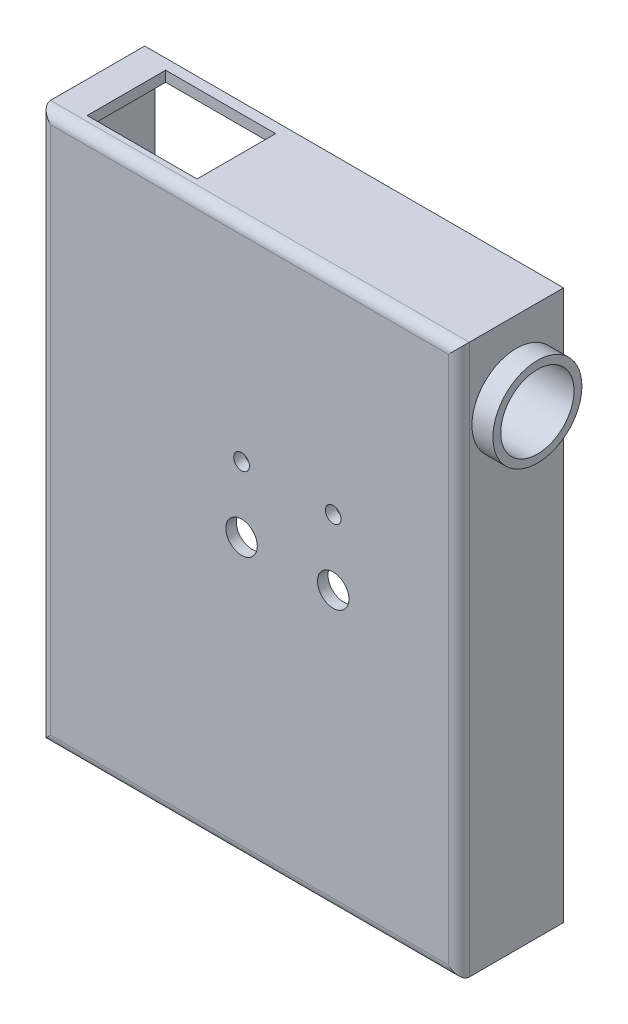
ISO-10303-21;
HEADER;
FILE_DESCRIPTION(('STEP AP214'),'2;1');
FILE_NAME('part.step','',(''),(''),'','','');
FILE_SCHEMA(('AUTOMOTIVE_DESIGN { 1 0 10303 214 1 1 1 1 }'));
ENDSEC;
DATA;
#1=APPLICATION_CONTEXT('core data for automotive mechanical design processes');
#2=APPLICATION_PROTOCOL_DEFINITION('international standard','automotive_design',2000,#1);
#3=PRODUCT_CONTEXT('',#1,'mechanical');
#4=PRODUCT('Part','Part','',(#3));
#5=PRODUCT_RELATED_PRODUCT_CATEGORY('part','',(#4));
#6=PRODUCT_DEFINITION_FORMATION('','',#4);
#7=PRODUCT_DEFINITION_CONTEXT('part definition',#1,'design');
#8=PRODUCT_DEFINITION('design','',#6,#7);
#9=PRODUCT_DEFINITION_SHAPE('','',#8);
#10=(LENGTH_UNIT() NAMED_UNIT(*) SI_UNIT(.MILLI.,.METRE.));
#11=(NAMED_UNIT(*) PLANE_ANGLE_UNIT() SI_UNIT($,.RADIAN.));
#12=(NAMED_UNIT(*) SI_UNIT($,.STERADIAN.) SOLID_ANGLE_UNIT());
#13=UNCERTAINTY_MEASURE_WITH_UNIT(LENGTH_MEASURE(1.E-05),#10,'distance_accuracy_value','');
#14=(GEOMETRIC_REPRESENTATION_CONTEXT(3) GLOBAL_UNCERTAINTY_ASSIGNED_CONTEXT((#13)) GLOBAL_UNIT_ASSIGNED_CONTEXT((#10,
#11,#12)) REPRESENTATION_CONTEXT('',''));
#15=CARTESIAN_POINT('',(0.,0.,0.));
#16=DIRECTION('',(0.,0.,1.));
#17=DIRECTION('',(1.,0.,0.));
#18=AXIS2_PLACEMENT_3D('',#15,#16,#17);
#19=CARTESIAN_POINT('',(0.,0.,18.));
#20=DIRECTION('',(0.,0.,-1.));
#21=DIRECTION('',(-1.,0.,0.));
#22=AXIS2_PLACEMENT_3D('',#19,#20,#21);
#23=PLANE('',#22);
#24=CARTESIAN_POINT('',(1039.51386895897,-1419.25124805023,18.));
#25=DIRECTION('',(0.,0.,-1.));
#26=DIRECTION('',(-1.,0.,0.));
#27=AXIS2_PLACEMENT_3D('',#24,#25,#26);
#28=CIRCLE('',#27,2.99999999999994);
#29=CARTESIAN_POINT('',(1036.51386895897,-1419.25124805023,18.));
#30=VERTEX_POINT('',#29);
#31=EDGE_CURVE('E189',#30,#30,#28,.T.);
#32=ORIENTED_EDGE('',*,*,#31,.F.);
#33=EDGE_LOOP('',(#32));
#34=FACE_BOUND('',#33,.T.);
#35=CARTESIAN_POINT('',(1087.51386895897,-1418.25124805023,18.));
#36=DIRECTION('',(0.,0.,-1.));
#37=DIRECTION('',(-1.,0.,0.));
#38=AXIS2_PLACEMENT_3D('',#35,#36,#37);
#39=CIRCLE('',#38,2.99999999999994);
#40=CARTESIAN_POINT('',(1084.51386895897,-1418.25124805023,18.));
#41=VERTEX_POINT('',#40);
#42=EDGE_CURVE('E357',#41,#41,#39,.T.);
#43=ORIENTED_EDGE('',*,*,#42,.F.);
#44=EDGE_LOOP('',(#43));
#45=FACE_BOUND('',#44,.T.);
#46=CARTESIAN_POINT('',(1087.51386895897,-1405.75124805023,18.));
#47=DIRECTION('',(0.,0.,-1.));
#48=DIRECTION('',(-1.,0.,0.));
#49=AXIS2_PLACEMENT_3D('',#46,#47,#48);
#50=CIRCLE('',#49,1.50000000000011);
#51=CARTESIAN_POINT('',(1086.01386895897,-1405.75124805023,18.));
#52=VERTEX_POINT('',#51);
#53=EDGE_CURVE('E353',#52,#52,#50,.T.);
#54=ORIENTED_EDGE('',*,*,#53,.F.);
#55=EDGE_LOOP('',(#54));
#56=FACE_BOUND('',#55,.T.);
#57=CARTESIAN_POINT('',(1070.01386895897,-1405.75124805023,18.));
#58=DIRECTION('',(0.,0.,-1.));
#59=DIRECTION('',(-1.,0.,0.));
#60=AXIS2_PLACEMENT_3D('',#57,#58,#59);
#61=CIRCLE('',#60,1.50000000000011);
#62=CARTESIAN_POINT('',(1068.51386895897,-1405.75124805023,18.));
#63=VERTEX_POINT('',#62);
#64=EDGE_CURVE('E349',#63,#63,#61,.T.);
#65=ORIENTED_EDGE('',*,*,#64,.F.);
#66=EDGE_LOOP('',(#65));
#67=FACE_BOUND('',#66,.T.);
#68=CARTESIAN_POINT('',(1070.01386895897,-1418.25124805023,18.));
#69=DIRECTION('',(0.,0.,-1.));
#70=DIRECTION('',(-1.,0.,0.));
#71=AXIS2_PLACEMENT_3D('',#68,#69,#70);
#72=CIRCLE('',#71,2.99999999999994);
#73=CARTESIAN_POINT('',(1067.01386895897,-1418.25124805023,18.));
#74=VERTEX_POINT('',#73);
#75=EDGE_CURVE('E338',#74,#74,#72,.T.);
#76=ORIENTED_EDGE('',*,*,#75,.F.);
#77=EDGE_LOOP('',(#76));
#78=FACE_BOUND('',#77,.T.);
#79=DIRECTION('',(0.,-1.,0.));
#80=VECTOR('',#79,1.);
#81=CARTESIAN_POINT('',(1109.51386895897,-1368.25124805023,18.));
#82=LINE('',#81,#80);
#83=CARTESIAN_POINT('',(1109.51386895897,-1368.25124805023,18.));
#84=VERTEX_POINT('',#83);
#85=CARTESIAN_POINT('',(1109.51386895897,-1469.25124805023,18.));
#86=VERTEX_POINT('',#85);
#87=EDGE_CURVE('E303',#84,#86,#82,.T.);
#88=ORIENTED_EDGE('',*,*,#87,.T.);
#89=DIRECTION('',(-1.,0.,0.));
#90=VECTOR('',#89,1.);
#91=CARTESIAN_POINT('',(1109.51386895897,-1469.25124805023,18.));
#92=LINE('',#91,#90);
#93=CARTESIAN_POINT('',(1033.51386895897,-1469.25124805023,18.));
#94=VERTEX_POINT('',#93);
#95=EDGE_CURVE('E307',#86,#94,#92,.T.);
#96=ORIENTED_EDGE('',*,*,#95,.T.);
#97=DIRECTION('',(0.,1.,0.));
#98=VECTOR('',#97,1.);
#99=CARTESIAN_POINT('',(1033.51386895897,-1368.25124805023,18.));
#100=LINE('',#99,#98);
#101=CARTESIAN_POINT('',(1033.51386895897,-1368.25124805023,18.));
#102=VERTEX_POINT('',#101);
#103=EDGE_CURVE('E312',#94,#102,#100,.T.);
#104=ORIENTED_EDGE('',*,*,#103,.T.);
#105=DIRECTION('',(1.,0.,0.));
#106=VECTOR('',#105,1.);
#107=CARTESIAN_POINT('',(1109.51386895897,-1368.25124805023,18.));
#108=LINE('',#107,#106);
#109=EDGE_CURVE('E316',#102,#84,#108,.T.);
#110=ORIENTED_EDGE('',*,*,#109,.T.);
#111=EDGE_LOOP('',(#88,#96,#104,#110));
#112=FACE_BOUND('',#111,.T.);
#113=DIRECTION('',(-1.,0.,0.));
#114=VECTOR('',#113,1.);
#115=CARTESIAN_POINT('',(1102.01386895897,-1389.75124805023,18.));
#116=LINE('',#115,#114);
#117=CARTESIAN_POINT('',(1102.01386895897,-1389.75124805023,18.));
#118=VERTEX_POINT('',#117);
#119=CARTESIAN_POINT('',(1072.01386895897,-1389.75124805023,18.));
#120=VERTEX_POINT('',#119);
#121=EDGE_CURVE('E263',#118,#120,#116,.T.);
#122=ORIENTED_EDGE('',*,*,#121,.F.);
#123=DIRECTION('',(0.,-1.,0.));
#124=VECTOR('',#123,1.);
#125=CARTESIAN_POINT('',(1102.01386895897,-1388.25124805023,18.));
#126=LINE('',#125,#124);
#127=CARTESIAN_POINT('',(1102.01386895897,-1388.25124805023,18.));
#128=VERTEX_POINT('',#127);
#129=EDGE_CURVE('E244',#128,#118,#126,.T.);
#130=ORIENTED_EDGE('',*,*,#129,.F.);
#131=DIRECTION('',(1.,0.,0.));
#132=VECTOR('',#131,1.);
#133=CARTESIAN_POINT('',(1102.01386895897,-1388.25124805023,18.));
#134=LINE('',#133,#132);
#135=CARTESIAN_POINT('',(1072.01386895897,-1388.25124805023,18.));
#136=VERTEX_POINT('',#135);
#137=EDGE_CURVE('E250',#136,#128,#134,.T.);
#138=ORIENTED_EDGE('',*,*,#137,.F.);
#139=DIRECTION('',(0.,1.,0.));
#140=VECTOR('',#139,1.);
#141=CARTESIAN_POINT('',(1072.01386895897,-1388.25124805023,18.));
#142=LINE('',#141,#140);
#143=EDGE_CURVE('E266',#120,#136,#142,.T.);
#144=ORIENTED_EDGE('',*,*,#143,.F.);
#145=EDGE_LOOP('',(#122,#130,#138,#144));
#146=FACE_BOUND('',#145,.T.);
#147=ADVANCED_FACE('F39',(#34,#45,#56,#67,#78,#112,#146),#23,.T.);
#148=CARTESIAN_POINT('',(1087.51386895897,-1418.25124805023,20.));
#149=DIRECTION('',(0.,0.,-1.));
#150=DIRECTION('',(-1.,0.,0.));
#151=AXIS2_PLACEMENT_3D('',#148,#149,#150);
#152=CYLINDRICAL_SURFACE('',#151,2.99999999999994);
#153=CARTESIAN_POINT('',(1087.51386895897,-1418.25124805023,20.));
#154=DIRECTION('',(0.,0.,1.));
#155=DIRECTION('',(1.,0.,0.));
#156=AXIS2_PLACEMENT_3D('',#153,#154,#155);
#157=CIRCLE('',#156,2.99999999999994);
#158=CARTESIAN_POINT('',(1090.51386895897,-1418.25124805023,20.));
#159=VERTEX_POINT('',#158);
#160=EDGE_CURVE('E366',#159,#159,#157,.T.);
#161=ORIENTED_EDGE('',*,*,#160,.T.);
#162=EDGE_LOOP('',(#161));
#163=FACE_BOUND('',#162,.T.);
#164=ORIENTED_EDGE('',*,*,#42,.T.);
#165=EDGE_LOOP('',(#164));
#166=FACE_BOUND('',#165,.T.);
#167=ADVANCED_FACE('F507',(#163,#166),#152,.F.);
#168=CARTESIAN_POINT('',(1087.51386895897,-1405.75124805023,20.));
#169=DIRECTION('',(0.,0.,-1.));
#170=DIRECTION('',(-1.,0.,0.));
#171=AXIS2_PLACEMENT_3D('',#168,#169,#170);
#172=CYLINDRICAL_SURFACE('',#171,1.50000000000011);
#173=CARTESIAN_POINT('',(1087.51386895897,-1405.75124805023,20.));
#174=DIRECTION('',(0.,0.,1.));
#175=DIRECTION('',(1.,0.,0.));
#176=AXIS2_PLACEMENT_3D('',#173,#174,#175);
#177=CIRCLE('',#176,1.50000000000011);
#178=CARTESIAN_POINT('',(1089.01386895897,-1405.75124805023,20.));
#179=VERTEX_POINT('',#178);
#180=EDGE_CURVE('E362',#179,#179,#177,.T.);
#181=ORIENTED_EDGE('',*,*,#180,.T.);
#182=EDGE_LOOP('',(#181));
#183=FACE_BOUND('',#182,.T.);
#184=ORIENTED_EDGE('',*,*,#53,.T.);
#185=EDGE_LOOP('',(#184));
#186=FACE_BOUND('',#185,.T.);
#187=ADVANCED_FACE('F510',(#183,#186),#172,.F.);
#188=CARTESIAN_POINT('',(1070.01386895897,-1405.75124805023,20.));
#189=DIRECTION('',(0.,0.,-1.));
#190=DIRECTION('',(-1.,0.,0.));
#191=AXIS2_PLACEMENT_3D('',#188,#189,#190);
#192=CYLINDRICAL_SURFACE('',#191,1.50000000000011);
#193=CARTESIAN_POINT('',(1070.01386895897,-1405.75124805023,20.));
#194=DIRECTION('',(0.,0.,1.));
#195=DIRECTION('',(1.,0.,0.));
#196=AXIS2_PLACEMENT_3D('',#193,#194,#195);
#197=CIRCLE('',#196,1.50000000000011);
#198=CARTESIAN_POINT('',(1071.51386895897,-1405.75124805023,20.));
#199=VERTEX_POINT('',#198);
#200=EDGE_CURVE('E367',#199,#199,#197,.T.);
#201=ORIENTED_EDGE('',*,*,#200,.T.);
#202=EDGE_LOOP('',(#201));
#203=FACE_BOUND('',#202,.T.);
#204=ORIENTED_EDGE('',*,*,#64,.T.);
#205=EDGE_LOOP('',(#204));
#206=FACE_BOUND('',#205,.T.);
#207=ADVANCED_FACE('F600',(#203,#206),#192,.F.);
#208=CARTESIAN_POINT('',(1070.01386895897,-1418.25124805023,20.));
#209=DIRECTION('',(0.,0.,-1.));
#210=DIRECTION('',(-1.,0.,0.));
#211=AXIS2_PLACEMENT_3D('',#208,#209,#210);
#212=CYLINDRICAL_SURFACE('',#211,2.99999999999994);
#213=CARTESIAN_POINT('',(1070.01386895897,-1418.25124805023,20.));
#214=DIRECTION('',(0.,0.,1.));
#215=DIRECTION('',(1.,0.,0.));
#216=AXIS2_PLACEMENT_3D('',#213,#214,#215);
#217=CIRCLE('',#216,2.99999999999994);
#218=CARTESIAN_POINT('',(1073.01386895897,-1418.25124805023,20.));
#219=VERTEX_POINT('',#218);
#220=EDGE_CURVE('E361',#219,#219,#217,.T.);
#221=ORIENTED_EDGE('',*,*,#220,.T.);
#222=EDGE_LOOP('',(#221));
#223=FACE_BOUND('',#222,.T.);
#224=ORIENTED_EDGE('',*,*,#75,.T.);
#225=EDGE_LOOP('',(#224));
#226=FACE_BOUND('',#225,.T.);
#227=ADVANCED_FACE('F604',(#223,#226),#212,.F.);
#228=CARTESIAN_POINT('',(1031.51386895897,-1366.25124805023,20.));
#229=DIRECTION('',(1.,0.,0.));
#230=DIRECTION('',(0.,0.,-1.));
#231=AXIS2_PLACEMENT_3D('',#228,#229,#230);
#232=PLANE('',#231);
#233=DIRECTION('',(0.,0.,-1.));
#234=VECTOR('',#233,1.);
#235=CARTESIAN_POINT('',(1031.51386895897,-1471.25124805023,20.));
#236=LINE('',#235,#234);
#237=CARTESIAN_POINT('',(1031.51386895897,-1471.25124805023,18.));
#238=VERTEX_POINT('',#237);
#239=CARTESIAN_POINT('',(1031.51386895897,-1471.25124805023,0.));
#240=VERTEX_POINT('',#239);
#241=EDGE_CURVE('E403',#238,#240,#236,.T.);
#242=ORIENTED_EDGE('',*,*,#241,.F.);
#243=DIRECTION('',(0.,-1.,0.));
#244=VECTOR('',#243,1.);
#245=CARTESIAN_POINT('',(1031.51386895897,-1366.25124805023,18.));
#246=LINE('',#245,#244);
#247=CARTESIAN_POINT('',(1031.51386895897,-1366.25124805023,18.));
#248=VERTEX_POINT('',#247);
#249=EDGE_CURVE('E449',#238,#248,#246,.F.);
#250=ORIENTED_EDGE('',*,*,#249,.T.);
#251=DIRECTION('',(0.,0.,-1.));
#252=VECTOR('',#251,1.);
#253=CARTESIAN_POINT('',(1031.51386895897,-1366.25124805023,20.));
#254=LINE('',#253,#252);
#255=CARTESIAN_POINT('',(1031.51386895897,-1366.25124805023,0.));
#256=VERTEX_POINT('',#255);
#257=EDGE_CURVE('E394',#248,#256,#254,.T.);
#258=ORIENTED_EDGE('',*,*,#257,.T.);
#259=DIRECTION('',(0.,-1.,0.));
#260=VECTOR('',#259,1.);
#261=CARTESIAN_POINT('',(1031.51386895897,-1366.25124805023,0.));
#262=LINE('',#261,#260);
#263=EDGE_CURVE('E377',#256,#240,#262,.T.);
#264=ORIENTED_EDGE('',*,*,#263,.T.);
#265=EDGE_LOOP('',(#242,#250,#258,#264));
#266=FACE_BOUND('',#265,.T.);
#267=ADVANCED_FACE('F487',(#266),#232,.F.);
#268=CARTESIAN_POINT('',(1031.51386895897,-1471.25124805023,20.));
#269=DIRECTION('',(0.,1.,0.));
#270=DIRECTION('',(0.,0.,1.));
#271=AXIS2_PLACEMENT_3D('',#268,#269,#270);
#272=PLANE('',#271);
#273=DIRECTION('',(0.,0.,-1.));
#274=VECTOR('',#273,1.);
#275=CARTESIAN_POINT('',(1111.51386895897,-1471.25124805023,20.));
#276=LINE('',#275,#274);
#277=CARTESIAN_POINT('',(1111.51386895897,-1471.25124805023,18.));
#278=VERTEX_POINT('',#277);
#279=CARTESIAN_POINT('',(1111.51386895897,-1471.25124805023,0.));
#280=VERTEX_POINT('',#279);
#281=EDGE_CURVE('E400',#278,#280,#276,.T.);
#282=ORIENTED_EDGE('',*,*,#281,.F.);
#283=DIRECTION('',(1.,0.,0.));
#284=VECTOR('',#283,1.);
#285=CARTESIAN_POINT('',(1031.51386895897,-1471.25124805023,18.));
#286=LINE('',#285,#284);
#287=EDGE_CURVE('E453',#278,#238,#286,.F.);
#288=ORIENTED_EDGE('',*,*,#287,.T.);
#289=ORIENTED_EDGE('',*,*,#241,.T.);
#290=DIRECTION('',(1.,0.,0.));
#291=VECTOR('',#290,1.);
#292=CARTESIAN_POINT('',(1031.51386895897,-1471.25124805023,0.));
#293=LINE('',#292,#291);
#294=CARTESIAN_POINT('',(1069.01386895897,-1471.25124805023,0.));
#295=VERTEX_POINT('',#294);
#296=EDGE_CURVE('E382',#240,#295,#293,.T.);
#297=ORIENTED_EDGE('',*,*,#296,.T.);
#298=CARTESIAN_POINT('',(1071.51386895897,-1471.25124805023,0.));
#299=DIRECTION('',(0.,1.,0.));
#300=DIRECTION('',(0.,0.,1.));
#301=AXIS2_PLACEMENT_3D('',#298,#299,#300);
#302=CIRCLE('',#301,2.49999999999991);
#303=CARTESIAN_POINT('',(1074.01386895897,-1471.25124805023,0.));
#304=VERTEX_POINT('',#303);
#305=EDGE_CURVE('E236',#295,#304,#302,.T.);
#306=ORIENTED_EDGE('',*,*,#305,.T.);
#307=EDGE_CURVE('E381',#304,#280,#293,.T.);
#308=ORIENTED_EDGE('',*,*,#307,.T.);
#309=EDGE_LOOP('',(#282,#288,#289,#297,#306,#308));
#310=FACE_BOUND('',#309,.T.);
#311=ADVANCED_FACE('F482',(#310),#272,.F.);
#312=CARTESIAN_POINT('',(1111.51386895897,-1366.25124805023,20.));
#313=DIRECTION('',(1.,0.,0.));
#314=DIRECTION('',(0.,1.,0.));
#315=AXIS2_PLACEMENT_3D('',#312,#313,#314);
#316=PLANE('',#315);
#317=CARTESIAN_POINT('',(1111.51386895897,-1380.25124805023,9.));
#318=DIRECTION('',(1.,0.,0.));
#319=DIRECTION('',(0.,1.,0.));
#320=AXIS2_PLACEMENT_3D('',#317,#318,#319);
#321=CIRCLE('',#320,8.49999999999992);
#322=CARTESIAN_POINT('',(1111.51386895897,-1371.75124805023,9.));
#323=VERTEX_POINT('',#322);
#324=EDGE_CURVE('E294',#323,#323,#321,.T.);
#325=ORIENTED_EDGE('',*,*,#324,.F.);
#326=EDGE_LOOP('',(#325));
#327=FACE_BOUND('',#326,.T.);
#328=DIRECTION('',(0.,0.,-1.));
#329=VECTOR('',#328,1.);
#330=CARTESIAN_POINT('',(1111.51386895897,-1366.25124805023,20.));
#331=LINE('',#330,#329);
#332=CARTESIAN_POINT('',(1111.51386895897,-1366.25124805023,18.));
#333=VERTEX_POINT('',#332);
#334=CARTESIAN_POINT('',(1111.51386895897,-1366.25124805023,0.));
#335=VERTEX_POINT('',#334);
#336=EDGE_CURVE('E397',#333,#335,#331,.T.);
#337=ORIENTED_EDGE('',*,*,#336,.F.);
#338=DIRECTION('',(0.,-1.,0.));
#339=VECTOR('',#338,1.);
#340=CARTESIAN_POINT('',(1111.51386895897,-1366.25124805023,18.));
#341=LINE('',#340,#339);
#342=EDGE_CURVE('E49',#333,#278,#341,.T.);
#343=ORIENTED_EDGE('',*,*,#342,.T.);
#344=ORIENTED_EDGE('',*,*,#281,.T.);
#345=DIRECTION('',(0.,-1.,0.));
#346=VECTOR('',#345,1.);
#347=CARTESIAN_POINT('',(1111.51386895897,-1366.25124805023,0.));
#348=LINE('',#347,#346);
#349=EDGE_CURVE('E386',#335,#280,#348,.T.);
#350=ORIENTED_EDGE('',*,*,#349,.F.);
#351=EDGE_LOOP('',(#337,#343,#344,#350));
#352=FACE_BOUND('',#351,.T.);
#353=ADVANCED_FACE('F614',(#327,#352),#316,.T.);
#354=CARTESIAN_POINT('',(1031.51386895897,-1366.25124805023,20.));
#355=DIRECTION('',(0.,1.,0.));
#356=DIRECTION('',(0.,0.,1.));
#357=AXIS2_PLACEMENT_3D('',#354,#355,#356);
#358=PLANE('',#357);
#359=DIRECTION('',(0.,0.,-1.));
#360=VECTOR('',#359,1.);
#361=CARTESIAN_POINT('',(1058.51386895897,-1366.25124805023,2.));
#362=LINE('',#361,#360);
#363=CARTESIAN_POINT('',(1058.51386895897,-1366.25124805023,17.));
#364=VERTEX_POINT('',#363);
#365=CARTESIAN_POINT('',(1058.51386895897,-1366.25124805023,2.));
#366=VERTEX_POINT('',#365);
#367=EDGE_CURVE('E204',#364,#366,#362,.T.);
#368=ORIENTED_EDGE('',*,*,#367,.F.);
#369=DIRECTION('',(1.,0.,0.));
#370=VECTOR('',#369,1.);
#371=CARTESIAN_POINT('',(1058.51386895897,-1366.25124805023,17.));
#372=LINE('',#371,#370);
#373=CARTESIAN_POINT('',(1037.51386895897,-1366.25124805023,17.));
#374=VERTEX_POINT('',#373);
#375=EDGE_CURVE('E215',#374,#364,#372,.T.);
#376=ORIENTED_EDGE('',*,*,#375,.F.);
#377=DIRECTION('',(0.,0.,1.));
#378=VECTOR('',#377,1.);
#379=CARTESIAN_POINT('',(1037.51386895897,-1366.25124805023,2.00000000000001));
#380=LINE('',#379,#378);
#381=CARTESIAN_POINT('',(1037.51386895897,-1366.25124805023,2.00000000000001));
#382=VERTEX_POINT('',#381);
#383=EDGE_CURVE('E211',#382,#374,#380,.T.);
#384=ORIENTED_EDGE('',*,*,#383,.F.);
#385=DIRECTION('',(-1.,0.,0.));
#386=VECTOR('',#385,1.);
#387=CARTESIAN_POINT('',(1058.51386895897,-1366.25124805023,2.));
#388=LINE('',#387,#386);
#389=EDGE_CURVE('E207',#366,#382,#388,.T.);
#390=ORIENTED_EDGE('',*,*,#389,.F.);
#391=EDGE_LOOP('',(#368,#376,#384,#390));
#392=FACE_BOUND('',#391,.T.);
#393=ORIENTED_EDGE('',*,*,#257,.F.);
#394=DIRECTION('',(1.,0.,0.));
#395=VECTOR('',#394,1.);
#396=CARTESIAN_POINT('',(1031.51386895897,-1366.25124805023,18.));
#397=LINE('',#396,#395);
#398=EDGE_CURVE('E11',#248,#333,#397,.T.);
#399=ORIENTED_EDGE('',*,*,#398,.T.);
#400=ORIENTED_EDGE('',*,*,#336,.T.);
#401=DIRECTION('',(1.,0.,0.));
#402=VECTOR('',#401,1.);
#403=CARTESIAN_POINT('',(1031.51386895897,-1366.25124805023,0.));
#404=LINE('',#403,#402);
#405=EDGE_CURVE('E390',#256,#335,#404,.T.);
#406=ORIENTED_EDGE('',*,*,#405,.F.);
#407=EDGE_LOOP('',(#393,#399,#400,#406));
#408=FACE_BOUND('',#407,.T.);
#409=ADVANCED_FACE('F497',(#392,#408),#358,.T.);
#410=CARTESIAN_POINT('',(0.,0.,20.));
#411=DIRECTION('',(0.,0.,1.));
#412=DIRECTION('',(1.,0.,0.));
#413=AXIS2_PLACEMENT_3D('',#410,#411,#412);
#414=PLANE('',#413);
#415=DIRECTION('',(1.,0.,0.));
#416=VECTOR('',#415,1.);
#417=CARTESIAN_POINT('',(0.,-1368.25124805023,20.));
#418=LINE('',#417,#416);
#419=CARTESIAN_POINT('',(1109.51386895897,-1368.25124805023,20.));
#420=VERTEX_POINT('',#419);
#421=CARTESIAN_POINT('',(1033.51386895897,-1368.25124805023,20.));
#422=VERTEX_POINT('',#421);
#423=EDGE_CURVE('E436',#420,#422,#418,.F.);
#424=ORIENTED_EDGE('',*,*,#423,.T.);
#425=DIRECTION('',(0.,-1.,0.));
#426=VECTOR('',#425,1.);
#427=CARTESIAN_POINT('',(1033.51386895897,-1471.25124805023,20.));
#428=LINE('',#427,#426);
#429=CARTESIAN_POINT('',(1033.51386895897,-1469.25124805023,20.));
#430=VERTEX_POINT('',#429);
#431=EDGE_CURVE('E445',#422,#430,#428,.T.);
#432=ORIENTED_EDGE('',*,*,#431,.T.);
#433=DIRECTION('',(1.,0.,0.));
#434=VECTOR('',#433,1.);
#435=CARTESIAN_POINT('',(1111.51386895897,-1469.25124805023,20.));
#436=LINE('',#435,#434);
#437=CARTESIAN_POINT('',(1109.51386895897,-1469.25124805023,20.));
#438=VERTEX_POINT('',#437);
#439=EDGE_CURVE('E442',#430,#438,#436,.T.);
#440=ORIENTED_EDGE('',*,*,#439,.T.);
#441=DIRECTION('',(0.,-1.,0.));
#442=VECTOR('',#441,1.);
#443=CARTESIAN_POINT('',(1109.51386895897,-2.34630065420798E-12,20.));
#444=LINE('',#443,#442);
#445=EDGE_CURVE('E439',#438,#420,#444,.F.);
#446=ORIENTED_EDGE('',*,*,#445,.T.);
#447=EDGE_LOOP('',(#424,#432,#440,#446));
#448=FACE_BOUND('',#447,.T.);
#449=ORIENTED_EDGE('',*,*,#220,.F.);
#450=EDGE_LOOP('',(#449));
#451=FACE_BOUND('',#450,.T.);
#452=ORIENTED_EDGE('',*,*,#200,.F.);
#453=EDGE_LOOP('',(#452));
#454=FACE_BOUND('',#453,.T.);
#455=ORIENTED_EDGE('',*,*,#180,.F.);
#456=EDGE_LOOP('',(#455));
#457=FACE_BOUND('',#456,.T.);
#458=ORIENTED_EDGE('',*,*,#160,.F.);
#459=EDGE_LOOP('',(#458));
#460=FACE_BOUND('',#459,.T.);
#461=ADVANCED_FACE('F493',(#448,#451,#454,#457,#460),#414,.T.);
#462=CARTESIAN_POINT('',(0.,0.,0.));
#463=DIRECTION('',(0.,0.,1.));
#464=DIRECTION('',(1.,0.,0.));
#465=AXIS2_PLACEMENT_3D('',#462,#463,#464);
#466=PLANE('',#465);
#467=ORIENTED_EDGE('',*,*,#307,.F.);
#468=DIRECTION('',(0.,1.,0.));
#469=VECTOR('',#468,1.);
#470=CARTESIAN_POINT('',(1074.01386895897,-1483.25124805023,0.));
#471=LINE('',#470,#469);
#472=CARTESIAN_POINT('',(1074.01386895897,-1469.25124805023,0.));
#473=VERTEX_POINT('',#472);
#474=EDGE_CURVE('E240',#304,#473,#471,.T.);
#475=ORIENTED_EDGE('',*,*,#474,.T.);
#476=DIRECTION('',(-1.,0.,0.));
#477=VECTOR('',#476,1.);
#478=CARTESIAN_POINT('',(1109.51386895897,-1469.25124805023,0.));
#479=LINE('',#478,#477);
#480=CARTESIAN_POINT('',(1109.51386895897,-1469.25124805023,0.));
#481=VERTEX_POINT('',#480);
#482=EDGE_CURVE('E324',#481,#473,#479,.T.);
#483=ORIENTED_EDGE('',*,*,#482,.F.);
#484=DIRECTION('',(0.,-1.,0.));
#485=VECTOR('',#484,1.);
#486=CARTESIAN_POINT('',(1109.51386895897,-1368.25124805023,0.));
#487=LINE('',#486,#485);
#488=CARTESIAN_POINT('',(1109.51386895897,-1368.25124805023,0.));
#489=VERTEX_POINT('',#488);
#490=EDGE_CURVE('E299',#489,#481,#487,.T.);
#491=ORIENTED_EDGE('',*,*,#490,.F.);
#492=DIRECTION('',(1.,0.,0.));
#493=VECTOR('',#492,1.);
#494=CARTESIAN_POINT('',(1109.51386895897,-1368.25124805023,0.));
#495=LINE('',#494,#493);
#496=CARTESIAN_POINT('',(1033.51386895897,-1368.25124805023,0.));
#497=VERTEX_POINT('',#496);
#498=EDGE_CURVE('E308',#497,#489,#495,.T.);
#499=ORIENTED_EDGE('',*,*,#498,.F.);
#500=DIRECTION('',(0.,1.,0.));
#501=VECTOR('',#500,1.);
#502=CARTESIAN_POINT('',(1033.51386895897,-1368.25124805023,0.));
#503=LINE('',#502,#501);
#504=CARTESIAN_POINT('',(1033.51386895897,-1469.25124805023,0.));
#505=VERTEX_POINT('',#504);
#506=EDGE_CURVE('E328',#505,#497,#503,.T.);
#507=ORIENTED_EDGE('',*,*,#506,.F.);
#508=CARTESIAN_POINT('',(1069.01386895897,-1469.25124805023,0.));
#509=VERTEX_POINT('',#508);
#510=EDGE_CURVE('E323',#509,#505,#479,.T.);
#511=ORIENTED_EDGE('',*,*,#510,.F.);
#512=DIRECTION('',(0.,1.,0.));
#513=VECTOR('',#512,1.);
#514=CARTESIAN_POINT('',(1069.01386895897,-1483.25124805023,0.));
#515=LINE('',#514,#513);
#516=EDGE_CURVE('E223',#509,#295,#515,.F.);
#517=ORIENTED_EDGE('',*,*,#516,.T.);
#518=ORIENTED_EDGE('',*,*,#296,.F.);
#519=ORIENTED_EDGE('',*,*,#263,.F.);
#520=ORIENTED_EDGE('',*,*,#405,.T.);
#521=ORIENTED_EDGE('',*,*,#349,.T.);
#522=EDGE_LOOP('',(#467,#475,#483,#491,#499,#507,#511,#517,#518,#519,#520,#521));
#523=FACE_BOUND('',#522,.T.);
#524=ADVANCED_FACE('F496',(#523),#466,.F.);
#525=CARTESIAN_POINT('',(1109.51386895897,-1368.25124805023,18.));
#526=DIRECTION('',(1.,0.,0.));
#527=DIRECTION('',(0.,0.,-1.));
#528=AXIS2_PLACEMENT_3D('',#525,#526,#527);
#529=PLANE('',#528);
#530=CARTESIAN_POINT('',(1109.51386895897,-1380.25124805023,9.));
#531=DIRECTION('',(1.,0.,0.));
#532=DIRECTION('',(0.,0.,-1.));
#533=AXIS2_PLACEMENT_3D('',#530,#531,#532);
#534=CIRCLE('',#533,8.49999999999994);
#535=CARTESIAN_POINT('',(1109.51386895897,-1380.25124805023,0.500000000000058));
#536=VERTEX_POINT('',#535);
#537=EDGE_CURVE('E406',#536,#536,#534,.F.);
#538=ORIENTED_EDGE('',*,*,#537,.F.);
#539=EDGE_LOOP('',(#538));
#540=FACE_BOUND('',#539,.T.);
#541=ORIENTED_EDGE('',*,*,#490,.T.);
#542=DIRECTION('',(0.,0.,-1.));
#543=VECTOR('',#542,1.);
#544=CARTESIAN_POINT('',(1109.51386895897,-1469.25124805023,18.));
#545=LINE('',#544,#543);
#546=EDGE_CURVE('E320',#86,#481,#545,.T.);
#547=ORIENTED_EDGE('',*,*,#546,.F.);
#548=ORIENTED_EDGE('',*,*,#87,.F.);
#549=DIRECTION('',(0.,0.,-1.));
#550=VECTOR('',#549,1.);
#551=CARTESIAN_POINT('',(1109.51386895897,-1368.25124805023,18.));
#552=LINE('',#551,#550);
#553=EDGE_CURVE('E335',#84,#489,#552,.T.);
#554=ORIENTED_EDGE('',*,*,#553,.T.);
#555=EDGE_LOOP('',(#541,#547,#548,#554));
#556=FACE_BOUND('',#555,.T.);
#557=ADVANCED_FACE('F587',(#540,#556),#529,.F.);
#558=CARTESIAN_POINT('',(1109.51386895897,-1368.25124805023,18.));
#559=DIRECTION('',(0.,1.,0.));
#560=DIRECTION('',(0.,0.,1.));
#561=AXIS2_PLACEMENT_3D('',#558,#559,#560);
#562=PLANE('',#561);
#563=DIRECTION('',(1.,0.,0.));
#564=VECTOR('',#563,1.);
#565=CARTESIAN_POINT('',(1109.51386895897,-1368.25124805023,17.));
#566=LINE('',#565,#564);
#567=CARTESIAN_POINT('',(1037.51386895897,-1368.25124805023,17.));
#568=VERTEX_POINT('',#567);
#569=CARTESIAN_POINT('',(1058.51386895897,-1368.25124805023,17.));
#570=VERTEX_POINT('',#569);
#571=EDGE_CURVE('E428',#568,#570,#566,.T.);
#572=ORIENTED_EDGE('',*,*,#571,.T.);
#573=DIRECTION('',(0.,0.,-1.));
#574=VECTOR('',#573,1.);
#575=CARTESIAN_POINT('',(1058.51386895897,-1368.25124805023,18.));
#576=LINE('',#575,#574);
#577=CARTESIAN_POINT('',(1058.51386895897,-1368.25124805023,2.));
#578=VERTEX_POINT('',#577);
#579=EDGE_CURVE('E432',#570,#578,#576,.T.);
#580=ORIENTED_EDGE('',*,*,#579,.T.);
#581=DIRECTION('',(-1.,0.,0.));
#582=VECTOR('',#581,1.);
#583=CARTESIAN_POINT('',(1109.51386895897,-1368.25124805023,1.99999999999999));
#584=LINE('',#583,#582);
#585=CARTESIAN_POINT('',(1037.51386895897,-1368.25124805023,2.));
#586=VERTEX_POINT('',#585);
#587=EDGE_CURVE('E420',#578,#586,#584,.T.);
#588=ORIENTED_EDGE('',*,*,#587,.T.);
#589=DIRECTION('',(0.,0.,1.));
#590=VECTOR('',#589,1.);
#591=CARTESIAN_POINT('',(1037.51386895897,-1368.25124805023,18.));
#592=LINE('',#591,#590);
#593=EDGE_CURVE('E424',#586,#568,#592,.T.);
#594=ORIENTED_EDGE('',*,*,#593,.T.);
#595=EDGE_LOOP('',(#572,#580,#588,#594));
#596=FACE_BOUND('',#595,.T.);
#597=ORIENTED_EDGE('',*,*,#498,.T.);
#598=ORIENTED_EDGE('',*,*,#553,.F.);
#599=ORIENTED_EDGE('',*,*,#109,.F.);
#600=DIRECTION('',(0.,0.,-1.));
#601=VECTOR('',#600,1.);
#602=CARTESIAN_POINT('',(1033.51386895897,-1368.25124805023,18.));
#603=LINE('',#602,#601);
#604=EDGE_CURVE('E339',#102,#497,#603,.T.);
#605=ORIENTED_EDGE('',*,*,#604,.T.);
#606=EDGE_LOOP('',(#597,#598,#599,#605));
#607=FACE_BOUND('',#606,.T.);
#608=ADVANCED_FACE('F583',(#596,#607),#562,.F.);
#609=CARTESIAN_POINT('',(1033.51386895897,-1368.25124805023,18.));
#610=DIRECTION('',(-1.,0.,0.));
#611=DIRECTION('',(0.,0.,1.));
#612=AXIS2_PLACEMENT_3D('',#609,#610,#611);
#613=PLANE('',#612);
#614=ORIENTED_EDGE('',*,*,#506,.T.);
#615=ORIENTED_EDGE('',*,*,#604,.F.);
#616=ORIENTED_EDGE('',*,*,#103,.F.);
#617=DIRECTION('',(0.,0.,-1.));
#618=VECTOR('',#617,1.);
#619=CARTESIAN_POINT('',(1033.51386895897,-1469.25124805023,18.));
#620=LINE('',#619,#618);
#621=EDGE_CURVE('E342',#94,#505,#620,.T.);
#622=ORIENTED_EDGE('',*,*,#621,.T.);
#623=EDGE_LOOP('',(#614,#615,#616,#622));
#624=FACE_BOUND('',#623,.T.);
#625=ADVANCED_FACE('F586',(#624),#613,.F.);
#626=CARTESIAN_POINT('',(1109.51386895897,-1469.25124805023,18.));
#627=DIRECTION('',(0.,-1.,0.));
#628=DIRECTION('',(0.,0.,-1.));
#629=AXIS2_PLACEMENT_3D('',#626,#627,#628);
#630=PLANE('',#629);
#631=ORIENTED_EDGE('',*,*,#482,.T.);
#632=CARTESIAN_POINT('',(1071.51386895897,-1469.25124805023,0.));
#633=DIRECTION('',(0.,-1.,0.));
#634=DIRECTION('',(0.,0.,-1.));
#635=AXIS2_PLACEMENT_3D('',#632,#633,#634);
#636=CIRCLE('',#635,2.49999999999991);
#637=EDGE_CURVE('E413',#473,#509,#636,.T.);
#638=ORIENTED_EDGE('',*,*,#637,.T.);
#639=ORIENTED_EDGE('',*,*,#510,.T.);
#640=ORIENTED_EDGE('',*,*,#621,.F.);
#641=ORIENTED_EDGE('',*,*,#95,.F.);
#642=ORIENTED_EDGE('',*,*,#546,.T.);
#643=EDGE_LOOP('',(#631,#638,#639,#640,#641,#642));
#644=FACE_BOUND('',#643,.T.);
#645=ADVANCED_FACE('F580',(#644),#630,.F.);
#646=CARTESIAN_POINT('',(1115.51386895897,-1380.25124805023,9.));
#647=DIRECTION('',(-1.,0.,0.));
#648=DIRECTION('',(0.,-1.,0.));
#649=AXIS2_PLACEMENT_3D('',#646,#647,#648);
#650=CYLINDRICAL_SURFACE('',#649,8.49999999999992);
#651=CARTESIAN_POINT('',(1115.51386895897,-1380.25124805023,9.));
#652=DIRECTION('',(1.,0.,0.));
#653=DIRECTION('',(0.,1.,0.));
#654=AXIS2_PLACEMENT_3D('',#651,#652,#653);
#655=CIRCLE('',#654,8.49999999999992);
#656=CARTESIAN_POINT('',(1115.51386895897,-1371.75124805023,9.));
#657=VERTEX_POINT('',#656);
#658=EDGE_CURVE('E295',#657,#657,#655,.T.);
#659=ORIENTED_EDGE('',*,*,#658,.F.);
#660=EDGE_LOOP('',(#659));
#661=FACE_BOUND('',#660,.T.);
#662=ORIENTED_EDGE('',*,*,#324,.T.);
#663=EDGE_LOOP('',(#662));
#664=FACE_BOUND('',#663,.T.);
#665=ADVANCED_FACE('F577',(#661,#664),#650,.T.);
#666=CARTESIAN_POINT('',(1115.51386895897,-1380.25124805023,9.));
#667=DIRECTION('',(1.,0.,0.));
#668=DIRECTION('',(0.,1.,0.));
#669=AXIS2_PLACEMENT_3D('',#666,#667,#668);
#670=PLANE('',#669);
#671=CARTESIAN_POINT('',(1115.51386895897,-1380.25124805023,9.));
#672=DIRECTION('',(1.,0.,0.));
#673=DIRECTION('',(0.,1.,0.));
#674=AXIS2_PLACEMENT_3D('',#671,#672,#673);
#675=CIRCLE('',#674,7.);
#676=CARTESIAN_POINT('',(1115.51386895897,-1373.25124805023,9.));
#677=VERTEX_POINT('',#676);
#678=EDGE_CURVE('E285',#677,#677,#675,.T.);
#679=ORIENTED_EDGE('',*,*,#678,.F.);
#680=EDGE_LOOP('',(#679));
#681=FACE_BOUND('',#680,.T.);
#682=ORIENTED_EDGE('',*,*,#658,.T.);
#683=EDGE_LOOP('',(#682));
#684=FACE_BOUND('',#683,.T.);
#685=ADVANCED_FACE('F573',(#681,#684),#670,.T.);
#686=CARTESIAN_POINT('',(1105.51386895897,-1380.25124805023,9.));
#687=DIRECTION('',(1.,0.,0.));
#688=DIRECTION('',(0.,0.,-1.));
#689=AXIS2_PLACEMENT_3D('',#686,#687,#688);
#690=CYLINDRICAL_SURFACE('',#689,8.49999999999994);
#691=CARTESIAN_POINT('',(1105.51386895897,-1380.25124805023,9.));
#692=DIRECTION('',(-1.,0.,0.));
#693=DIRECTION('',(0.,0.,1.));
#694=AXIS2_PLACEMENT_3D('',#691,#692,#693);
#695=CIRCLE('',#694,8.49999999999994);
#696=CARTESIAN_POINT('',(1105.51386895897,-1380.25124805023,17.4999999999999));
#697=VERTEX_POINT('',#696);
#698=EDGE_CURVE('E290',#697,#697,#695,.T.);
#699=ORIENTED_EDGE('',*,*,#698,.F.);
#700=EDGE_LOOP('',(#699));
#701=FACE_BOUND('',#700,.T.);
#702=ORIENTED_EDGE('',*,*,#537,.T.);
#703=EDGE_LOOP('',(#702));
#704=FACE_BOUND('',#703,.T.);
#705=ADVANCED_FACE('F569',(#701,#704),#690,.T.);
#706=CARTESIAN_POINT('',(1105.51386895897,-1380.25124805023,9.));
#707=DIRECTION('',(-1.,0.,0.));
#708=DIRECTION('',(0.,0.,1.));
#709=AXIS2_PLACEMENT_3D('',#706,#707,#708);
#710=PLANE('',#709);
#711=CARTESIAN_POINT('',(1105.51386895897,-1380.25124805023,9.));
#712=DIRECTION('',(-1.,0.,0.));
#713=DIRECTION('',(0.,0.,1.));
#714=AXIS2_PLACEMENT_3D('',#711,#712,#713);
#715=CIRCLE('',#714,7.);
#716=CARTESIAN_POINT('',(1105.51386895897,-1380.25124805023,16.));
#717=VERTEX_POINT('',#716);
#718=EDGE_CURVE('E289',#717,#717,#715,.T.);
#719=ORIENTED_EDGE('',*,*,#718,.F.);
#720=EDGE_LOOP('',(#719));
#721=FACE_BOUND('',#720,.T.);
#722=ORIENTED_EDGE('',*,*,#698,.T.);
#723=EDGE_LOOP('',(#722));
#724=FACE_BOUND('',#723,.T.);
#725=ADVANCED_FACE('F565',(#721,#724),#710,.T.);
#726=CARTESIAN_POINT('',(1091.51386895897,-1380.25124805023,9.));
#727=DIRECTION('',(1.,0.,0.));
#728=DIRECTION('',(0.,1.,0.));
#729=AXIS2_PLACEMENT_3D('',#726,#727,#728);
#730=CYLINDRICAL_SURFACE('',#729,7.);
#731=ORIENTED_EDGE('',*,*,#718,.T.);
#732=EDGE_LOOP('',(#731));
#733=FACE_BOUND('',#732,.T.);
#734=ORIENTED_EDGE('',*,*,#678,.T.);
#735=EDGE_LOOP('',(#734));
#736=FACE_BOUND('',#735,.T.);
#737=ADVANCED_FACE('F562',(#733,#736),#730,.F.);
#738=CARTESIAN_POINT('',(1102.01386895897,-1388.25124805023,4.));
#739=DIRECTION('',(-1.,0.,0.));
#740=DIRECTION('',(0.,0.,1.));
#741=AXIS2_PLACEMENT_3D('',#738,#739,#740);
#742=PLANE('',#741);
#743=ORIENTED_EDGE('',*,*,#129,.T.);
#744=DIRECTION('',(0.,0.,1.));
#745=VECTOR('',#744,1.);
#746=CARTESIAN_POINT('',(1102.01386895897,-1389.75124805023,4.));
#747=LINE('',#746,#745);
#748=CARTESIAN_POINT('',(1102.01386895897,-1389.75124805023,4.));
#749=VERTEX_POINT('',#748);
#750=EDGE_CURVE('E282',#749,#118,#747,.T.);
#751=ORIENTED_EDGE('',*,*,#750,.F.);
#752=DIRECTION('',(0.,-1.,0.));
#753=VECTOR('',#752,1.);
#754=CARTESIAN_POINT('',(1102.01386895897,-1388.25124805023,4.));
#755=LINE('',#754,#753);
#756=CARTESIAN_POINT('',(1102.01386895897,-1388.25124805023,4.));
#757=VERTEX_POINT('',#756);
#758=EDGE_CURVE('E245',#757,#749,#755,.T.);
#759=ORIENTED_EDGE('',*,*,#758,.F.);
#760=DIRECTION('',(0.,0.,1.));
#761=VECTOR('',#760,1.);
#762=CARTESIAN_POINT('',(1102.01386895897,-1388.25124805023,4.));
#763=LINE('',#762,#761);
#764=EDGE_CURVE('E259',#757,#128,#763,.T.);
#765=ORIENTED_EDGE('',*,*,#764,.T.);
#766=EDGE_LOOP('',(#743,#751,#759,#765));
#767=FACE_BOUND('',#766,.T.);
#768=ADVANCED_FACE('F544',(#767),#742,.F.);
#769=CARTESIAN_POINT('',(1102.01386895897,-1389.75124805023,4.));
#770=DIRECTION('',(0.,1.,0.));
#771=DIRECTION('',(0.,0.,1.));
#772=AXIS2_PLACEMENT_3D('',#769,#770,#771);
#773=PLANE('',#772);
#774=ORIENTED_EDGE('',*,*,#121,.T.);
#775=DIRECTION('',(0.,0.,1.));
#776=VECTOR('',#775,1.);
#777=CARTESIAN_POINT('',(1072.01386895897,-1389.75124805023,4.));
#778=LINE('',#777,#776);
#779=CARTESIAN_POINT('',(1072.01386895897,-1389.75124805023,4.));
#780=VERTEX_POINT('',#779);
#781=EDGE_CURVE('E278',#780,#120,#778,.T.);
#782=ORIENTED_EDGE('',*,*,#781,.F.);
#783=DIRECTION('',(-1.,0.,0.));
#784=VECTOR('',#783,1.);
#785=CARTESIAN_POINT('',(1102.01386895897,-1389.75124805023,4.));
#786=LINE('',#785,#784);
#787=EDGE_CURVE('E249',#749,#780,#786,.T.);
#788=ORIENTED_EDGE('',*,*,#787,.F.);
#789=ORIENTED_EDGE('',*,*,#750,.T.);
#790=EDGE_LOOP('',(#774,#782,#788,#789));
#791=FACE_BOUND('',#790,.T.);
#792=ADVANCED_FACE('F532',(#791),#773,.F.);
#793=CARTESIAN_POINT('',(1072.01386895897,-1388.25124805023,4.));
#794=DIRECTION('',(1.,0.,0.));
#795=DIRECTION('',(0.,0.,-1.));
#796=AXIS2_PLACEMENT_3D('',#793,#794,#795);
#797=PLANE('',#796);
#798=ORIENTED_EDGE('',*,*,#143,.T.);
#799=DIRECTION('',(0.,0.,1.));
#800=VECTOR('',#799,1.);
#801=CARTESIAN_POINT('',(1072.01386895897,-1388.25124805023,4.));
#802=LINE('',#801,#800);
#803=CARTESIAN_POINT('',(1072.01386895897,-1388.25124805023,4.));
#804=VERTEX_POINT('',#803);
#805=EDGE_CURVE('E275',#804,#136,#802,.T.);
#806=ORIENTED_EDGE('',*,*,#805,.F.);
#807=DIRECTION('',(0.,1.,0.));
#808=VECTOR('',#807,1.);
#809=CARTESIAN_POINT('',(1072.01386895897,-1388.25124805023,4.));
#810=LINE('',#809,#808);
#811=EDGE_CURVE('E253',#780,#804,#810,.T.);
#812=ORIENTED_EDGE('',*,*,#811,.F.);
#813=ORIENTED_EDGE('',*,*,#781,.T.);
#814=EDGE_LOOP('',(#798,#806,#812,#813));
#815=FACE_BOUND('',#814,.T.);
#816=ADVANCED_FACE('F536',(#815),#797,.F.);
#817=CARTESIAN_POINT('',(1102.01386895897,-1388.25124805023,4.));
#818=DIRECTION('',(0.,-1.,0.));
#819=DIRECTION('',(0.,0.,-1.));
#820=AXIS2_PLACEMENT_3D('',#817,#818,#819);
#821=PLANE('',#820);
#822=ORIENTED_EDGE('',*,*,#137,.T.);
#823=ORIENTED_EDGE('',*,*,#764,.F.);
#824=DIRECTION('',(1.,0.,0.));
#825=VECTOR('',#824,1.);
#826=CARTESIAN_POINT('',(1102.01386895897,-1388.25124805023,4.));
#827=LINE('',#826,#825);
#828=EDGE_CURVE('E256',#804,#757,#827,.T.);
#829=ORIENTED_EDGE('',*,*,#828,.F.);
#830=ORIENTED_EDGE('',*,*,#805,.T.);
#831=EDGE_LOOP('',(#822,#823,#829,#830));
#832=FACE_BOUND('',#831,.T.);
#833=ADVANCED_FACE('F546',(#832),#821,.F.);
#834=CARTESIAN_POINT('',(0.,0.,4.));
#835=DIRECTION('',(0.,0.,-1.));
#836=DIRECTION('',(-1.,0.,0.));
#837=AXIS2_PLACEMENT_3D('',#834,#835,#836);
#838=PLANE('',#837);
#839=ORIENTED_EDGE('',*,*,#758,.T.);
#840=ORIENTED_EDGE('',*,*,#787,.T.);
#841=ORIENTED_EDGE('',*,*,#811,.T.);
#842=ORIENTED_EDGE('',*,*,#828,.T.);
#843=EDGE_LOOP('',(#839,#840,#841,#842));
#844=FACE_BOUND('',#843,.T.);
#845=ADVANCED_FACE('F540',(#844),#838,.T.);
#846=CARTESIAN_POINT('',(1071.51386895897,-1483.25124805023,0.));
#847=DIRECTION('',(0.,1.,0.));
#848=DIRECTION('',(0.,0.,1.));
#849=AXIS2_PLACEMENT_3D('',#846,#847,#848);
#850=CYLINDRICAL_SURFACE('',#849,2.49999999999991);
#851=ORIENTED_EDGE('',*,*,#305,.F.);
#852=ORIENTED_EDGE('',*,*,#516,.F.);
#853=ORIENTED_EDGE('',*,*,#637,.F.);
#854=ORIENTED_EDGE('',*,*,#474,.F.);
#855=EDGE_LOOP('',(#851,#852,#853,#854));
#856=FACE_BOUND('',#855,.T.);
#857=ADVANCED_FACE('F553',(#856),#850,.F.);
#858=CARTESIAN_POINT('',(1058.51386895897,-1380.25124805023,2.));
#859=DIRECTION('',(1.,0.,0.));
#860=DIRECTION('',(0.,0.,-1.));
#861=AXIS2_PLACEMENT_3D('',#858,#859,#860);
#862=PLANE('',#861);
#863=DIRECTION('',(0.,1.,0.));
#864=VECTOR('',#863,1.);
#865=CARTESIAN_POINT('',(1058.51386895897,-1380.25124805023,17.));
#866=LINE('',#865,#864);
#867=EDGE_CURVE('E220',#570,#364,#866,.T.);
#868=ORIENTED_EDGE('',*,*,#867,.T.);
#869=ORIENTED_EDGE('',*,*,#367,.T.);
#870=DIRECTION('',(0.,1.,0.));
#871=VECTOR('',#870,1.);
#872=CARTESIAN_POINT('',(1058.51386895897,-1380.25124805023,2.));
#873=LINE('',#872,#871);
#874=EDGE_CURVE('E219',#578,#366,#873,.T.);
#875=ORIENTED_EDGE('',*,*,#874,.F.);
#876=ORIENTED_EDGE('',*,*,#579,.F.);
#877=EDGE_LOOP('',(#868,#869,#875,#876));
#878=FACE_BOUND('',#877,.T.);
#879=ADVANCED_FACE('F646',(#878),#862,.F.);
#880=CARTESIAN_POINT('',(1058.51386895897,-1380.25124805023,17.));
#881=DIRECTION('',(0.,0.,1.));
#882=DIRECTION('',(1.,0.,0.));
#883=AXIS2_PLACEMENT_3D('',#880,#881,#882);
#884=PLANE('',#883);
#885=DIRECTION('',(0.,1.,0.));
#886=VECTOR('',#885,1.);
#887=CARTESIAN_POINT('',(1037.51386895897,-1380.25124805023,17.));
#888=LINE('',#887,#886);
#889=EDGE_CURVE('E224',#568,#374,#888,.T.);
#890=ORIENTED_EDGE('',*,*,#889,.T.);
#891=ORIENTED_EDGE('',*,*,#375,.T.);
#892=ORIENTED_EDGE('',*,*,#867,.F.);
#893=ORIENTED_EDGE('',*,*,#571,.F.);
#894=EDGE_LOOP('',(#890,#891,#892,#893));
#895=FACE_BOUND('',#894,.T.);
#896=ADVANCED_FACE('F641',(#895),#884,.F.);
#897=CARTESIAN_POINT('',(1037.51386895897,-1380.25124805023,2.00000000000001));
#898=DIRECTION('',(-1.,0.,0.));
#899=DIRECTION('',(0.,0.,1.));
#900=AXIS2_PLACEMENT_3D('',#897,#898,#899);
#901=PLANE('',#900);
#902=DIRECTION('',(0.,1.,0.));
#903=VECTOR('',#902,1.);
#904=CARTESIAN_POINT('',(1037.51386895897,-1380.25124805023,2.00000000000001));
#905=LINE('',#904,#903);
#906=EDGE_CURVE('E227',#586,#382,#905,.T.);
#907=ORIENTED_EDGE('',*,*,#906,.T.);
#908=ORIENTED_EDGE('',*,*,#383,.T.);
#909=ORIENTED_EDGE('',*,*,#889,.F.);
#910=ORIENTED_EDGE('',*,*,#593,.F.);
#911=EDGE_LOOP('',(#907,#908,#909,#910));
#912=FACE_BOUND('',#911,.T.);
#913=ADVANCED_FACE('F635',(#912),#901,.F.);
#914=CARTESIAN_POINT('',(1058.51386895897,-1380.25124805023,2.));
#915=DIRECTION('',(0.,0.,-1.));
#916=DIRECTION('',(-1.,0.,0.));
#917=AXIS2_PLACEMENT_3D('',#914,#915,#916);
#918=PLANE('',#917);
#919=ORIENTED_EDGE('',*,*,#874,.T.);
#920=ORIENTED_EDGE('',*,*,#389,.T.);
#921=ORIENTED_EDGE('',*,*,#906,.F.);
#922=ORIENTED_EDGE('',*,*,#587,.F.);
#923=EDGE_LOOP('',(#919,#920,#921,#922));
#924=FACE_BOUND('',#923,.T.);
#925=ADVANCED_FACE('F631',(#924),#918,.F.);
#926=CARTESIAN_POINT('',(1109.51386895897,-1366.25124805023,18.));
#927=DIRECTION('',(0.,-1.,0.));
#928=DIRECTION('',(1.,0.,0.));
#929=AXIS2_PLACEMENT_3D('',#926,#927,#928);
#930=CYLINDRICAL_SURFACE('',#929,2.);
#931=CARTESIAN_POINT('',(1109.51386895897,-1469.25124805023,18.));
#932=DIRECTION('',(-0.707106781186548,-0.707106781186547,0.));
#933=DIRECTION('',(0.707106781186547,-0.707106781186548,0.));
#934=AXIS2_PLACEMENT_3D('',#931,#932,#933);
#935=ELLIPSE('',#934,2.82842712474619,2.);
#936=EDGE_CURVE('E462',#278,#438,#935,.T.);
#937=ORIENTED_EDGE('',*,*,#936,.F.);
#938=ORIENTED_EDGE('',*,*,#342,.F.);
#939=CARTESIAN_POINT('',(1109.51386895897,-1368.25124805023,18.));
#940=DIRECTION('',(0.707106781186547,-0.707106781186548,0.));
#941=DIRECTION('',(0.707106781186548,0.707106781186547,0.));
#942=AXIS2_PLACEMENT_3D('',#939,#940,#941);
#943=ELLIPSE('',#942,2.82842712474619,2.);
#944=EDGE_CURVE('E43',#420,#333,#943,.F.);
#945=ORIENTED_EDGE('',*,*,#944,.F.);
#946=ORIENTED_EDGE('',*,*,#445,.F.);
#947=EDGE_LOOP('',(#937,#938,#945,#946));
#948=FACE_BOUND('',#947,.T.);
#949=ADVANCED_FACE('F41',(#948),#930,.T.);
#950=CARTESIAN_POINT('',(1031.51386895897,-1368.25124805023,18.));
#951=DIRECTION('',(1.,0.,0.));
#952=DIRECTION('',(0.,0.,-1.));
#953=AXIS2_PLACEMENT_3D('',#950,#951,#952);
#954=CYLINDRICAL_SURFACE('',#953,2.);
#955=ORIENTED_EDGE('',*,*,#944,.T.);
#956=ORIENTED_EDGE('',*,*,#398,.F.);
#957=CARTESIAN_POINT('',(1033.51386895897,-1368.25124805023,18.));
#958=DIRECTION('',(0.707106781186547,0.707106781186547,0.));
#959=DIRECTION('',(0.707106781186547,-0.707106781186547,0.));
#960=AXIS2_PLACEMENT_3D('',#957,#958,#959);
#961=ELLIPSE('',#960,2.82842712474619,2.);
#962=EDGE_CURVE('E460',#422,#248,#961,.F.);
#963=ORIENTED_EDGE('',*,*,#962,.F.);
#964=ORIENTED_EDGE('',*,*,#423,.F.);
#965=EDGE_LOOP('',(#955,#956,#963,#964));
#966=FACE_BOUND('',#965,.T.);
#967=ADVANCED_FACE('F474',(#966),#954,.T.);
#968=CARTESIAN_POINT('',(0.,-1469.25124805023,18.));
#969=DIRECTION('',(-1.,0.,0.));
#970=DIRECTION('',(0.,0.,1.));
#971=AXIS2_PLACEMENT_3D('',#968,#969,#970);
#972=CYLINDRICAL_SURFACE('',#971,2.);
#973=ORIENTED_EDGE('',*,*,#936,.T.);
#974=ORIENTED_EDGE('',*,*,#439,.F.);
#975=CARTESIAN_POINT('',(1033.51386895897,-1469.25124805023,18.));
#976=DIRECTION('',(-0.707106781186547,0.707106781186547,0.));
#977=DIRECTION('',(-0.707106781186547,-0.707106781186547,0.));
#978=AXIS2_PLACEMENT_3D('',#975,#976,#977);
#979=ELLIPSE('',#978,2.82842712474619,2.);
#980=EDGE_CURVE('E202',#238,#430,#979,.T.);
#981=ORIENTED_EDGE('',*,*,#980,.F.);
#982=ORIENTED_EDGE('',*,*,#287,.F.);
#983=EDGE_LOOP('',(#973,#974,#981,#982));
#984=FACE_BOUND('',#983,.T.);
#985=ADVANCED_FACE('F479',(#984),#972,.T.);
#986=CARTESIAN_POINT('',(1033.51386895897,0.,18.));
#987=DIRECTION('',(0.,1.,0.));
#988=DIRECTION('',(0.,0.,1.));
#989=AXIS2_PLACEMENT_3D('',#986,#987,#988);
#990=CYLINDRICAL_SURFACE('',#989,2.);
#991=ORIENTED_EDGE('',*,*,#962,.T.);
#992=ORIENTED_EDGE('',*,*,#249,.F.);
#993=ORIENTED_EDGE('',*,*,#980,.T.);
#994=ORIENTED_EDGE('',*,*,#431,.F.);
#995=EDGE_LOOP('',(#991,#992,#993,#994));
#996=FACE_BOUND('',#995,.T.);
#997=ADVANCED_FACE('F490',(#996),#990,.T.);
#998=CARTESIAN_POINT('',(1039.51386895897,-1419.25124805023,-2.));
#999=DIRECTION('',(0.,0.,1.));
#1000=DIRECTION('',(1.,0.,0.));
#1001=AXIS2_PLACEMENT_3D('',#998,#999,#1000);
#1002=CYLINDRICAL_SURFACE('',#1001,2.99999999999994);
#1003=CARTESIAN_POINT('',(1039.51386895897,-1419.25124805023,-2.));
#1004=DIRECTION('',(0.,0.,-1.));
#1005=DIRECTION('',(-1.,0.,0.));
#1006=AXIS2_PLACEMENT_3D('',#1003,#1004,#1005);
#1007=CIRCLE('',#1006,2.99999999999994);
#1008=CARTESIAN_POINT('',(1036.51386895897,-1419.25124805023,-2.));
#1009=VERTEX_POINT('',#1008);
#1010=EDGE_CURVE('E195',#1009,#1009,#1007,.T.);
#1011=ORIENTED_EDGE('',*,*,#1010,.F.);
#1012=EDGE_LOOP('',(#1011));
#1013=FACE_BOUND('',#1012,.T.);
#1014=ORIENTED_EDGE('',*,*,#31,.T.);
#1015=EDGE_LOOP('',(#1014));
#1016=FACE_BOUND('',#1015,.T.);
#1017=ADVANCED_FACE('F625',(#1013,#1016),#1002,.T.);
#1018=CARTESIAN_POINT('',(1039.51386895897,-1419.25124805023,-2.));
#1019=DIRECTION('',(0.,0.,-1.));
#1020=DIRECTION('',(-1.,0.,0.));
#1021=AXIS2_PLACEMENT_3D('',#1018,#1019,#1020);
#1022=PLANE('',#1021);
#1023=CARTESIAN_POINT('',(1039.42632013348,-1419.28253147331,-2.));
#1024=DIRECTION('',(0.,0.,-1.));
#1025=DIRECTION('',(-1.,0.,0.));
#1026=AXIS2_PLACEMENT_3D('',#1023,#1024,#1025);
#1027=CIRCLE('',#1026,1.13030000000003);
#1028=CARTESIAN_POINT('',(1038.29602013348,-1419.28253147331,-2.));
#1029=VERTEX_POINT('',#1028);
#1030=EDGE_CURVE('E190',#1029,#1029,#1027,.T.);
#1031=ORIENTED_EDGE('',*,*,#1030,.F.);
#1032=EDGE_LOOP('',(#1031));
#1033=FACE_BOUND('',#1032,.T.);
#1034=ORIENTED_EDGE('',*,*,#1010,.T.);
#1035=EDGE_LOOP('',(#1034));
#1036=FACE_BOUND('',#1035,.T.);
#1037=ADVANCED_FACE('F182',(#1033,#1036),#1022,.T.);
#1038=CARTESIAN_POINT('',(1039.42632013348,-1419.28253147331,11.05));
#1039=DIRECTION('',(0.,0.,-1.));
#1040=DIRECTION('',(-1.,0.,0.));
#1041=AXIS2_PLACEMENT_3D('',#1038,#1039,#1040);
#1042=CONICAL_SURFACE('',#1041,1.13030000000003,1.02974425867667);
#1043=CARTESIAN_POINT('',(1039.42632013348,-1419.28253147331,11.7291527576869));
#1044=VERTEX_POINT('',#1043);
#1045=VERTEX_LOOP('',#1044);
#1046=FACE_BOUND('',#1045,.T.);
#1047=CARTESIAN_POINT('',(1039.42632013348,-1419.28253147331,11.05));
#1048=DIRECTION('',(0.,0.,-1.));
#1049=DIRECTION('',(-1.,0.,0.));
#1050=AXIS2_PLACEMENT_3D('',#1047,#1048,#1049);
#1051=CIRCLE('',#1050,1.13030000000003);
#1052=CARTESIAN_POINT('',(1038.29602013348,-1419.28253147331,11.05));
#1053=VERTEX_POINT('',#1052);
#1054=EDGE_CURVE('E186',#1053,#1053,#1051,.T.);
#1055=ORIENTED_EDGE('',*,*,#1054,.T.);
#1056=EDGE_LOOP('',(#1055));
#1057=FACE_BOUND('',#1056,.T.);
#1058=ADVANCED_FACE('F178',(#1046,#1057),#1042,.F.);
#1059=CARTESIAN_POINT('',(1039.42632013348,-1419.28253147331,-2.));
#1060=DIRECTION('',(0.,0.,-1.));
#1061=DIRECTION('',(-1.,0.,0.));
#1062=AXIS2_PLACEMENT_3D('',#1059,#1060,#1061);
#1063=CYLINDRICAL_SURFACE('',#1062,1.13030000000003);
#1064=ORIENTED_EDGE('',*,*,#1054,.F.);
#1065=EDGE_LOOP('',(#1064));
#1066=FACE_BOUND('',#1065,.T.);
#1067=ORIENTED_EDGE('',*,*,#1030,.T.);
#1068=EDGE_LOOP('',(#1067));
#1069=FACE_BOUND('',#1068,.T.);
#1070=ADVANCED_FACE('F181',(#1066,#1069),#1063,.F.);
#1071=CLOSED_SHELL('',(#147,#167,#187,#207,#227,#267,#311,#353,#409,#461,#524,#557,#608,#625,
#645,#665,#685,#705,#725,#737,#768,#792,#816,#833,#845,#857,#879,#896,#913,#925,#949,#967,#985,
#997,#1017,#1037,#1058,#1070));
#1072=MANIFOLD_SOLID_BREP('B2',#1071);
#1073=ADVANCED_BREP_SHAPE_REPRESENTATION('',(#18,#1072),#14);
#1074=SHAPE_DEFINITION_REPRESENTATION(#9,#1073);
ENDSEC;
END-ISO-10303-21;
